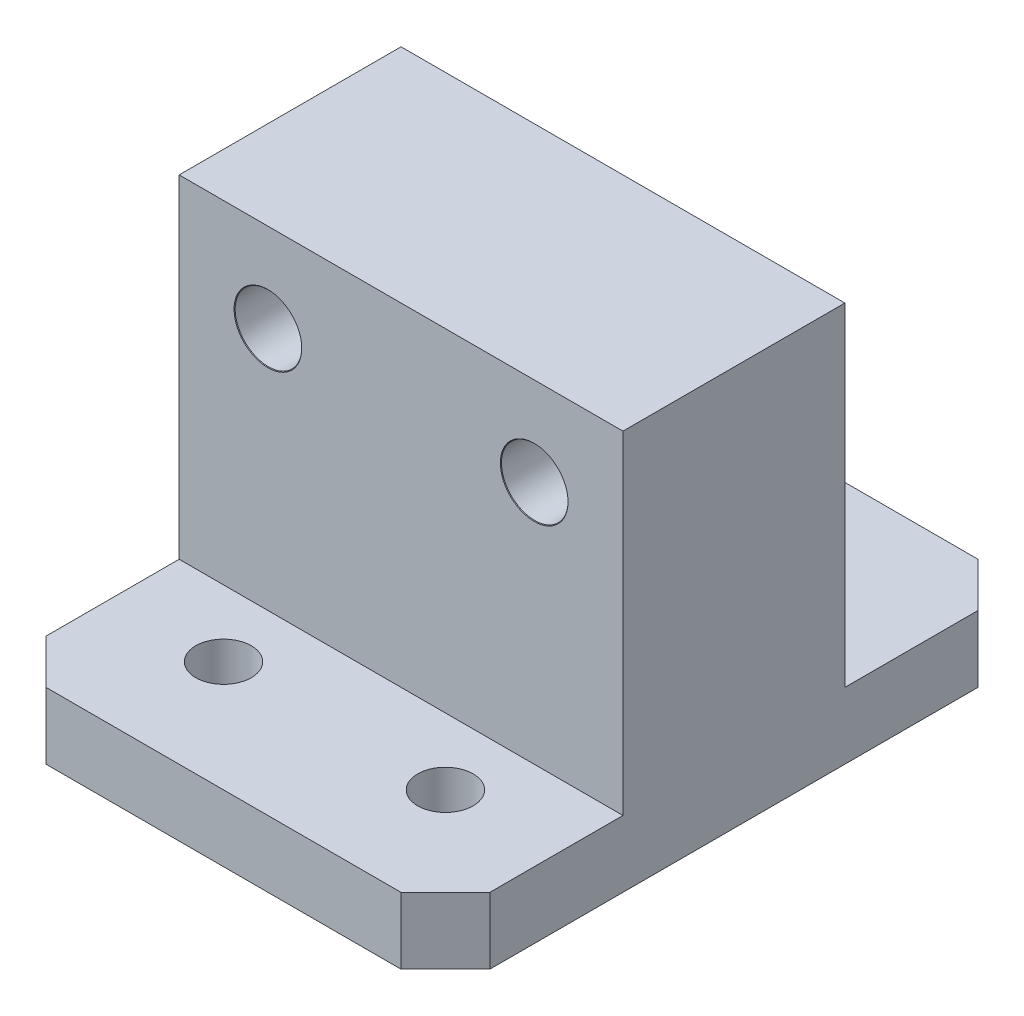
ISO-10303-21;
HEADER;
FILE_DESCRIPTION(('STEP AP214'),'2;1');
FILE_NAME('part.step','',(''),(''),'','','');
FILE_SCHEMA(('AUTOMOTIVE_DESIGN { 1 0 10303 214 1 1 1 1 }'));
ENDSEC;
DATA;
#1=APPLICATION_CONTEXT('core data for automotive mechanical design processes');
#2=APPLICATION_PROTOCOL_DEFINITION('international standard','automotive_design',2000,#1);
#3=PRODUCT_CONTEXT('',#1,'mechanical');
#4=PRODUCT('Part','Part','',(#3));
#5=PRODUCT_RELATED_PRODUCT_CATEGORY('part','',(#4));
#6=PRODUCT_DEFINITION_FORMATION('','',#4);
#7=PRODUCT_DEFINITION_CONTEXT('part definition',#1,'design');
#8=PRODUCT_DEFINITION('design','',#6,#7);
#9=PRODUCT_DEFINITION_SHAPE('','',#8);
#10=(LENGTH_UNIT() NAMED_UNIT(*) SI_UNIT(.MILLI.,.METRE.));
#11=(NAMED_UNIT(*) PLANE_ANGLE_UNIT() SI_UNIT($,.RADIAN.));
#12=(NAMED_UNIT(*) SI_UNIT($,.STERADIAN.) SOLID_ANGLE_UNIT());
#13=UNCERTAINTY_MEASURE_WITH_UNIT(LENGTH_MEASURE(1.E-05),#10,'distance_accuracy_value','');
#14=(GEOMETRIC_REPRESENTATION_CONTEXT(3) GLOBAL_UNCERTAINTY_ASSIGNED_CONTEXT((#13)) GLOBAL_UNIT_ASSIGNED_CONTEXT((#10,
#11,#12)) REPRESENTATION_CONTEXT('',''));
#15=CARTESIAN_POINT('',(0.,0.,0.));
#16=DIRECTION('',(0.,0.,1.));
#17=DIRECTION('',(1.,0.,0.));
#18=AXIS2_PLACEMENT_3D('',#15,#16,#17);
#19=CARTESIAN_POINT('',(0.,-3.,0.));
#20=DIRECTION('',(0.,1.,0.));
#21=DIRECTION('',(0.,0.,1.));
#22=AXIS2_PLACEMENT_3D('',#19,#20,#21);
#23=PLANE('',#22);
#24=CARTESIAN_POINT('',(15.,-3.,13.));
#25=DIRECTION('',(0.,-1.,0.));
#26=DIRECTION('',(0.,0.,-1.));
#27=AXIS2_PLACEMENT_3D('',#24,#25,#26);
#28=CIRCLE('',#27,1.275);
#29=CARTESIAN_POINT('',(15.,-3.,11.725));
#30=VERTEX_POINT('',#29);
#31=EDGE_CURVE('E370',#30,#30,#28,.T.);
#32=ORIENTED_EDGE('',*,*,#31,.F.);
#33=EDGE_LOOP('',(#32));
#34=FACE_BOUND('',#33,.T.);
#35=CARTESIAN_POINT('',(15.,-3.,-3.));
#36=DIRECTION('',(0.,-1.,0.));
#37=DIRECTION('',(0.,0.,-1.));
#38=AXIS2_PLACEMENT_3D('',#35,#36,#37);
#39=CIRCLE('',#38,1.275);
#40=CARTESIAN_POINT('',(15.,-3.,-4.275));
#41=VERTEX_POINT('',#40);
#42=EDGE_CURVE('E352',#41,#41,#39,.T.);
#43=ORIENTED_EDGE('',*,*,#42,.F.);
#44=EDGE_LOOP('',(#43));
#45=FACE_BOUND('',#44,.T.);
#46=DIRECTION('',(1.,0.,0.));
#47=VECTOR('',#46,1.);
#48=CARTESIAN_POINT('',(20.,-3.,-8.));
#49=LINE('',#48,#47);
#50=CARTESIAN_POINT('',(2.,-3.,-8.));
#51=VERTEX_POINT('',#50);
#52=CARTESIAN_POINT('',(18.,-3.,-8.));
#53=VERTEX_POINT('',#52);
#54=EDGE_CURVE('E206',#51,#53,#49,.T.);
#55=ORIENTED_EDGE('',*,*,#54,.T.);
#56=DIRECTION('',(-0.70710678118655,0.,-0.707106781186545));
#57=VECTOR('',#56,1.);
#58=CARTESIAN_POINT('',(20.,-3.,-6.));
#59=LINE('',#58,#57);
#60=CARTESIAN_POINT('',(20.,-3.,-6.));
#61=VERTEX_POINT('',#60);
#62=EDGE_CURVE('E183',#53,#61,#59,.F.);
#63=ORIENTED_EDGE('',*,*,#62,.T.);
#64=DIRECTION('',(0.,0.,1.));
#65=VECTOR('',#64,1.);
#66=CARTESIAN_POINT('',(20.,-3.,18.));
#67=LINE('',#66,#65);
#68=CARTESIAN_POINT('',(20.,-3.,16.));
#69=VERTEX_POINT('',#68);
#70=EDGE_CURVE('E216',#61,#69,#67,.T.);
#71=ORIENTED_EDGE('',*,*,#70,.T.);
#72=DIRECTION('',(0.707106781186546,0.,-0.707106781186549));
#73=VECTOR('',#72,1.);
#74=CARTESIAN_POINT('',(18.,-3.,18.));
#75=LINE('',#74,#73);
#76=CARTESIAN_POINT('',(18.,-3.,18.));
#77=VERTEX_POINT('',#76);
#78=EDGE_CURVE('E181',#69,#77,#75,.F.);
#79=ORIENTED_EDGE('',*,*,#78,.T.);
#80=DIRECTION('',(-1.,0.,0.));
#81=VECTOR('',#80,1.);
#82=CARTESIAN_POINT('',(20.,-3.,18.));
#83=LINE('',#82,#81);
#84=CARTESIAN_POINT('',(2.00000000000001,-3.,18.));
#85=VERTEX_POINT('',#84);
#86=EDGE_CURVE('E207',#77,#85,#83,.T.);
#87=ORIENTED_EDGE('',*,*,#86,.T.);
#88=DIRECTION('',(0.707106781186549,0.,0.707106781186546));
#89=VECTOR('',#88,1.);
#90=CARTESIAN_POINT('',(0.,-3.,16.));
#91=LINE('',#90,#89);
#92=CARTESIAN_POINT('',(0.,-3.,16.));
#93=VERTEX_POINT('',#92);
#94=EDGE_CURVE('E179',#85,#93,#91,.F.);
#95=ORIENTED_EDGE('',*,*,#94,.T.);
#96=DIRECTION('',(0.,0.,-1.));
#97=VECTOR('',#96,1.);
#98=CARTESIAN_POINT('',(0.,-3.,18.));
#99=LINE('',#98,#97);
#100=CARTESIAN_POINT('',(0.,-3.,-5.99999999999999));
#101=VERTEX_POINT('',#100);
#102=EDGE_CURVE('E197',#93,#101,#99,.T.);
#103=ORIENTED_EDGE('',*,*,#102,.T.);
#104=DIRECTION('',(-0.707106781186546,0.,0.707106781186549));
#105=VECTOR('',#104,1.);
#106=CARTESIAN_POINT('',(2.,-3.,-8.));
#107=LINE('',#106,#105);
#108=EDGE_CURVE('E177',#101,#51,#107,.F.);
#109=ORIENTED_EDGE('',*,*,#108,.T.);
#110=EDGE_LOOP('',(#55,#63,#71,#79,#87,#95,#103,#109));
#111=FACE_BOUND('',#110,.T.);
#112=CARTESIAN_POINT('',(5.,-3.,-3.));
#113=DIRECTION('',(0.,-1.,0.));
#114=DIRECTION('',(0.,0.,-1.));
#115=AXIS2_PLACEMENT_3D('',#112,#113,#114);
#116=CIRCLE('',#115,1.275);
#117=CARTESIAN_POINT('',(5.,-3.,-4.275));
#118=VERTEX_POINT('',#117);
#119=EDGE_CURVE('E361',#118,#118,#116,.T.);
#120=ORIENTED_EDGE('',*,*,#119,.F.);
#121=EDGE_LOOP('',(#120));
#122=FACE_BOUND('',#121,.T.);
#123=CARTESIAN_POINT('',(5.,-3.,13.));
#124=DIRECTION('',(0.,-1.,0.));
#125=DIRECTION('',(0.,0.,-1.));
#126=AXIS2_PLACEMENT_3D('',#123,#124,#125);
#127=CIRCLE('',#126,1.275);
#128=CARTESIAN_POINT('',(5.,-3.,11.725));
#129=VERTEX_POINT('',#128);
#130=EDGE_CURVE('E379',#129,#129,#127,.T.);
#131=ORIENTED_EDGE('',*,*,#130,.F.);
#132=EDGE_LOOP('',(#131));
#133=FACE_BOUND('',#132,.T.);
#134=ADVANCED_FACE('F37',(#34,#45,#111,#122,#133),#23,.F.);
#135=CARTESIAN_POINT('',(0.,0.,10.));
#136=DIRECTION('',(1.,0.,0.));
#137=DIRECTION('',(0.,0.,-1.));
#138=AXIS2_PLACEMENT_3D('',#135,#136,#137);
#139=PLANE('',#138);
#140=ORIENTED_EDGE('',*,*,#102,.F.);
#141=DIRECTION('',(0.,1.,0.));
#142=VECTOR('',#141,1.);
#143=CARTESIAN_POINT('',(0.,0.,16.));
#144=LINE('',#143,#142);
#145=CARTESIAN_POINT('',(0.,0.,16.));
#146=VERTEX_POINT('',#145);
#147=EDGE_CURVE('E11',#93,#146,#144,.T.);
#148=ORIENTED_EDGE('',*,*,#147,.T.);
#149=DIRECTION('',(0.,0.,-1.));
#150=VECTOR('',#149,1.);
#151=CARTESIAN_POINT('',(0.,0.,18.));
#152=LINE('',#151,#150);
#153=CARTESIAN_POINT('',(0.,0.,10.));
#154=VERTEX_POINT('',#153);
#155=EDGE_CURVE('E217',#146,#154,#152,.T.);
#156=ORIENTED_EDGE('',*,*,#155,.T.);
#157=DIRECTION('',(0.,-1.,0.));
#158=VECTOR('',#157,1.);
#159=CARTESIAN_POINT('',(0.,0.,10.));
#160=LINE('',#159,#158);
#161=CARTESIAN_POINT('',(0.,15.,10.));
#162=VERTEX_POINT('',#161);
#163=EDGE_CURVE('E155',#162,#154,#160,.T.);
#164=ORIENTED_EDGE('',*,*,#163,.F.);
#165=DIRECTION('',(0.,0.,-1.));
#166=VECTOR('',#165,1.);
#167=CARTESIAN_POINT('',(0.,15.,10.));
#168=LINE('',#167,#166);
#169=CARTESIAN_POINT('',(0.,15.,0.));
#170=VERTEX_POINT('',#169);
#171=EDGE_CURVE('E159',#162,#170,#168,.T.);
#172=ORIENTED_EDGE('',*,*,#171,.T.);
#173=DIRECTION('',(0.,-1.,0.));
#174=VECTOR('',#173,1.);
#175=CARTESIAN_POINT('',(0.,0.,0.));
#176=LINE('',#175,#174);
#177=CARTESIAN_POINT('',(0.,0.,0.));
#178=VERTEX_POINT('',#177);
#179=EDGE_CURVE('E149',#170,#178,#176,.T.);
#180=ORIENTED_EDGE('',*,*,#179,.T.);
#181=CARTESIAN_POINT('',(0.,0.,-5.99999999999999));
#182=VERTEX_POINT('',#181);
#183=EDGE_CURVE('E145',#178,#182,#152,.T.);
#184=ORIENTED_EDGE('',*,*,#183,.T.);
#185=DIRECTION('',(0.,-1.,0.));
#186=VECTOR('',#185,1.);
#187=CARTESIAN_POINT('',(0.,0.,-5.99999999999999));
#188=LINE('',#187,#186);
#189=EDGE_CURVE('E46',#182,#101,#188,.T.);
#190=ORIENTED_EDGE('',*,*,#189,.T.);
#191=EDGE_LOOP('',(#140,#148,#156,#164,#172,#180,#184,#190));
#192=FACE_BOUND('',#191,.T.);
#193=ADVANCED_FACE('F196',(#192),#139,.F.);
#194=CARTESIAN_POINT('',(20.,0.,10.));
#195=DIRECTION('',(-1.,0.,0.));
#196=DIRECTION('',(0.,0.,1.));
#197=AXIS2_PLACEMENT_3D('',#194,#195,#196);
#198=PLANE('',#197);
#199=ORIENTED_EDGE('',*,*,#70,.F.);
#200=DIRECTION('',(0.,1.,0.));
#201=VECTOR('',#200,1.);
#202=CARTESIAN_POINT('',(20.,0.,-6.));
#203=LINE('',#202,#201);
#204=CARTESIAN_POINT('',(20.,0.,-6.));
#205=VERTEX_POINT('',#204);
#206=EDGE_CURVE('E136',#61,#205,#203,.T.);
#207=ORIENTED_EDGE('',*,*,#206,.T.);
#208=DIRECTION('',(0.,0.,1.));
#209=VECTOR('',#208,1.);
#210=CARTESIAN_POINT('',(20.,0.,18.));
#211=LINE('',#210,#209);
#212=CARTESIAN_POINT('',(20.,0.,0.));
#213=VERTEX_POINT('',#212);
#214=EDGE_CURVE('E127',#205,#213,#211,.T.);
#215=ORIENTED_EDGE('',*,*,#214,.T.);
#216=DIRECTION('',(0.,1.,0.));
#217=VECTOR('',#216,1.);
#218=CARTESIAN_POINT('',(20.,0.,0.));
#219=LINE('',#218,#217);
#220=CARTESIAN_POINT('',(20.,15.,0.));
#221=VERTEX_POINT('',#220);
#222=EDGE_CURVE('E133',#213,#221,#219,.T.);
#223=ORIENTED_EDGE('',*,*,#222,.T.);
#224=DIRECTION('',(0.,0.,-1.));
#225=VECTOR('',#224,1.);
#226=CARTESIAN_POINT('',(20.,15.,10.));
#227=LINE('',#226,#225);
#228=CARTESIAN_POINT('',(20.,15.,10.));
#229=VERTEX_POINT('',#228);
#230=EDGE_CURVE('E162',#229,#221,#227,.T.);
#231=ORIENTED_EDGE('',*,*,#230,.F.);
#232=DIRECTION('',(0.,1.,0.));
#233=VECTOR('',#232,1.);
#234=CARTESIAN_POINT('',(20.,0.,10.));
#235=LINE('',#234,#233);
#236=CARTESIAN_POINT('',(20.,0.,10.));
#237=VERTEX_POINT('',#236);
#238=EDGE_CURVE('E247',#237,#229,#235,.T.);
#239=ORIENTED_EDGE('',*,*,#238,.F.);
#240=CARTESIAN_POINT('',(20.,0.,16.));
#241=VERTEX_POINT('',#240);
#242=EDGE_CURVE('E139',#237,#241,#211,.T.);
#243=ORIENTED_EDGE('',*,*,#242,.T.);
#244=DIRECTION('',(0.,-1.,0.));
#245=VECTOR('',#244,1.);
#246=CARTESIAN_POINT('',(20.,0.,16.));
#247=LINE('',#246,#245);
#248=EDGE_CURVE('E165',#241,#69,#247,.T.);
#249=ORIENTED_EDGE('',*,*,#248,.T.);
#250=EDGE_LOOP('',(#199,#207,#215,#223,#231,#239,#243,#249));
#251=FACE_BOUND('',#250,.T.);
#252=ADVANCED_FACE('F130',(#251),#198,.F.);
#253=CARTESIAN_POINT('',(0.,15.,10.));
#254=DIRECTION('',(0.,-1.,0.));
#255=DIRECTION('',(0.,0.,-1.));
#256=AXIS2_PLACEMENT_3D('',#253,#254,#255);
#257=PLANE('',#256);
#258=DIRECTION('',(-1.,0.,0.));
#259=VECTOR('',#258,1.);
#260=CARTESIAN_POINT('',(0.,15.,0.));
#261=LINE('',#260,#259);
#262=EDGE_CURVE('E153',#221,#170,#261,.T.);
#263=ORIENTED_EDGE('',*,*,#262,.T.);
#264=ORIENTED_EDGE('',*,*,#171,.F.);
#265=DIRECTION('',(-1.,0.,0.));
#266=VECTOR('',#265,1.);
#267=CARTESIAN_POINT('',(0.,15.,10.));
#268=LINE('',#267,#266);
#269=EDGE_CURVE('E163',#229,#162,#268,.T.);
#270=ORIENTED_EDGE('',*,*,#269,.F.);
#271=ORIENTED_EDGE('',*,*,#230,.T.);
#272=EDGE_LOOP('',(#263,#264,#270,#271));
#273=FACE_BOUND('',#272,.T.);
#274=ADVANCED_FACE('F253',(#273),#257,.F.);
#275=CARTESIAN_POINT('',(0.,0.,10.));
#276=DIRECTION('',(0.,0.,-1.));
#277=DIRECTION('',(-1.,0.,0.));
#278=AXIS2_PLACEMENT_3D('',#275,#276,#277);
#279=PLANE('',#278);
#280=CARTESIAN_POINT('',(4.,11.,10.));
#281=DIRECTION('',(0.,0.,1.));
#282=DIRECTION('',(1.,0.,0.));
#283=AXIS2_PLACEMENT_3D('',#280,#281,#282);
#284=CIRCLE('',#283,1.525);
#285=CARTESIAN_POINT('',(5.525,11.,10.));
#286=VERTEX_POINT('',#285);
#287=EDGE_CURVE('E224',#286,#286,#284,.T.);
#288=ORIENTED_EDGE('',*,*,#287,.F.);
#289=EDGE_LOOP('',(#288));
#290=FACE_BOUND('',#289,.T.);
#291=CARTESIAN_POINT('',(16.,11.,10.));
#292=DIRECTION('',(0.,0.,1.));
#293=DIRECTION('',(1.,0.,0.));
#294=AXIS2_PLACEMENT_3D('',#291,#292,#293);
#295=CIRCLE('',#294,1.525);
#296=CARTESIAN_POINT('',(17.525,11.,10.));
#297=VERTEX_POINT('',#296);
#298=EDGE_CURVE('E233',#297,#297,#295,.T.);
#299=ORIENTED_EDGE('',*,*,#298,.F.);
#300=EDGE_LOOP('',(#299));
#301=FACE_BOUND('',#300,.T.);
#302=ORIENTED_EDGE('',*,*,#163,.T.);
#303=DIRECTION('',(1.,0.,0.));
#304=VECTOR('',#303,1.);
#305=CARTESIAN_POINT('',(0.,0.,10.));
#306=LINE('',#305,#304);
#307=EDGE_CURVE('E244',#154,#237,#306,.T.);
#308=ORIENTED_EDGE('',*,*,#307,.T.);
#309=ORIENTED_EDGE('',*,*,#238,.T.);
#310=ORIENTED_EDGE('',*,*,#269,.T.);
#311=EDGE_LOOP('',(#302,#308,#309,#310));
#312=FACE_BOUND('',#311,.T.);
#313=ADVANCED_FACE('F258',(#290,#301,#312),#279,.F.);
#314=CARTESIAN_POINT('',(0.,0.,0.));
#315=DIRECTION('',(0.,0.,-1.));
#316=DIRECTION('',(-1.,0.,0.));
#317=AXIS2_PLACEMENT_3D('',#314,#315,#316);
#318=PLANE('',#317);
#319=CARTESIAN_POINT('',(4.,11.,0.));
#320=DIRECTION('',(0.,0.,1.));
#321=DIRECTION('',(1.,0.,0.));
#322=AXIS2_PLACEMENT_3D('',#319,#320,#321);
#323=CIRCLE('',#322,1.5);
#324=CARTESIAN_POINT('',(5.5,11.,0.));
#325=VERTEX_POINT('',#324);
#326=EDGE_CURVE('E230',#325,#325,#323,.T.);
#327=ORIENTED_EDGE('',*,*,#326,.T.);
#328=EDGE_LOOP('',(#327));
#329=FACE_BOUND('',#328,.T.);
#330=CARTESIAN_POINT('',(16.,11.,0.));
#331=DIRECTION('',(0.,0.,1.));
#332=DIRECTION('',(1.,0.,0.));
#333=AXIS2_PLACEMENT_3D('',#330,#331,#332);
#334=CIRCLE('',#333,1.5);
#335=CARTESIAN_POINT('',(17.5,11.,0.));
#336=VERTEX_POINT('',#335);
#337=EDGE_CURVE('E239',#336,#336,#334,.T.);
#338=ORIENTED_EDGE('',*,*,#337,.T.);
#339=EDGE_LOOP('',(#338));
#340=FACE_BOUND('',#339,.T.);
#341=ORIENTED_EDGE('',*,*,#179,.F.);
#342=ORIENTED_EDGE('',*,*,#262,.F.);
#343=ORIENTED_EDGE('',*,*,#222,.F.);
#344=DIRECTION('',(1.,0.,0.));
#345=VECTOR('',#344,1.);
#346=CARTESIAN_POINT('',(0.,0.,0.));
#347=LINE('',#346,#345);
#348=EDGE_CURVE('E142',#178,#213,#347,.T.);
#349=ORIENTED_EDGE('',*,*,#348,.F.);
#350=EDGE_LOOP('',(#341,#342,#343,#349));
#351=FACE_BOUND('',#350,.T.);
#352=ADVANCED_FACE('F152',(#329,#340,#351),#318,.T.);
#353=CARTESIAN_POINT('',(16.,11.,10.));
#354=DIRECTION('',(0.,0.,1.));
#355=DIRECTION('',(1.,0.,0.));
#356=AXIS2_PLACEMENT_3D('',#353,#354,#355);
#357=CYLINDRICAL_SURFACE('',#356,1.49999999999999);
#358=ORIENTED_EDGE('',*,*,#337,.F.);
#359=EDGE_LOOP('',(#358));
#360=FACE_BOUND('',#359,.T.);
#361=CARTESIAN_POINT('',(16.,11.,9.975));
#362=DIRECTION('',(0.,0.,1.));
#363=DIRECTION('',(1.,0.,0.));
#364=AXIS2_PLACEMENT_3D('',#361,#362,#363);
#365=CIRCLE('',#364,1.49999999999999);
#366=CARTESIAN_POINT('',(17.5,11.,9.975));
#367=VERTEX_POINT('',#366);
#368=EDGE_CURVE('E236',#367,#367,#365,.T.);
#369=ORIENTED_EDGE('',*,*,#368,.T.);
#370=EDGE_LOOP('',(#369));
#371=FACE_BOUND('',#370,.T.);
#372=ADVANCED_FACE('F312',(#360,#371),#357,.F.);
#373=CARTESIAN_POINT('',(16.,11.,10.));
#374=DIRECTION('',(0.,0.,1.));
#375=DIRECTION('',(1.,0.,0.));
#376=AXIS2_PLACEMENT_3D('',#373,#374,#375);
#377=CONICAL_SURFACE('',#376,1.525,0.785398163397691);
#378=ORIENTED_EDGE('',*,*,#368,.F.);
#379=EDGE_LOOP('',(#378));
#380=FACE_BOUND('',#379,.T.);
#381=ORIENTED_EDGE('',*,*,#298,.T.);
#382=EDGE_LOOP('',(#381));
#383=FACE_BOUND('',#382,.T.);
#384=ADVANCED_FACE('F308',(#380,#383),#377,.F.);
#385=CARTESIAN_POINT('',(4.,11.,10.));
#386=DIRECTION('',(0.,0.,1.));
#387=DIRECTION('',(1.,0.,0.));
#388=AXIS2_PLACEMENT_3D('',#385,#386,#387);
#389=CYLINDRICAL_SURFACE('',#388,1.49999999999999);
#390=ORIENTED_EDGE('',*,*,#326,.F.);
#391=EDGE_LOOP('',(#390));
#392=FACE_BOUND('',#391,.T.);
#393=CARTESIAN_POINT('',(4.,11.,9.975));
#394=DIRECTION('',(0.,0.,1.));
#395=DIRECTION('',(1.,0.,0.));
#396=AXIS2_PLACEMENT_3D('',#393,#394,#395);
#397=CIRCLE('',#396,1.49999999999999);
#398=CARTESIAN_POINT('',(5.49999999999999,11.,9.975));
#399=VERTEX_POINT('',#398);
#400=EDGE_CURVE('E227',#399,#399,#397,.T.);
#401=ORIENTED_EDGE('',*,*,#400,.T.);
#402=EDGE_LOOP('',(#401));
#403=FACE_BOUND('',#402,.T.);
#404=ADVANCED_FACE('F304',(#392,#403),#389,.F.);
#405=CARTESIAN_POINT('',(4.,11.,10.));
#406=DIRECTION('',(0.,0.,1.));
#407=DIRECTION('',(1.,0.,0.));
#408=AXIS2_PLACEMENT_3D('',#405,#406,#407);
#409=CONICAL_SURFACE('',#408,1.525,0.785398163397726);
#410=ORIENTED_EDGE('',*,*,#400,.F.);
#411=EDGE_LOOP('',(#410));
#412=FACE_BOUND('',#411,.T.);
#413=ORIENTED_EDGE('',*,*,#287,.T.);
#414=EDGE_LOOP('',(#413));
#415=FACE_BOUND('',#414,.T.);
#416=ADVANCED_FACE('F301',(#412,#415),#409,.F.);
#417=CARTESIAN_POINT('',(0.,0.,0.));
#418=DIRECTION('',(0.,1.,0.));
#419=DIRECTION('',(0.,0.,1.));
#420=AXIS2_PLACEMENT_3D('',#417,#418,#419);
#421=PLANE('',#420);
#422=CARTESIAN_POINT('',(5.,0.,13.));
#423=DIRECTION('',(0.,1.,0.));
#424=DIRECTION('',(0.,0.,1.));
#425=AXIS2_PLACEMENT_3D('',#422,#423,#424);
#426=CIRCLE('',#425,1.25);
#427=CARTESIAN_POINT('',(5.,0.,14.25));
#428=VERTEX_POINT('',#427);
#429=EDGE_CURVE('E373',#428,#428,#426,.T.);
#430=ORIENTED_EDGE('',*,*,#429,.F.);
#431=EDGE_LOOP('',(#430));
#432=FACE_BOUND('',#431,.T.);
#433=CARTESIAN_POINT('',(15.,0.,13.));
#434=DIRECTION('',(0.,1.,0.));
#435=DIRECTION('',(0.,0.,1.));
#436=AXIS2_PLACEMENT_3D('',#433,#434,#435);
#437=CIRCLE('',#436,1.25);
#438=CARTESIAN_POINT('',(15.,0.,14.25));
#439=VERTEX_POINT('',#438);
#440=EDGE_CURVE('E364',#439,#439,#437,.T.);
#441=ORIENTED_EDGE('',*,*,#440,.F.);
#442=EDGE_LOOP('',(#441));
#443=FACE_BOUND('',#442,.T.);
#444=DIRECTION('',(-1.,0.,0.));
#445=VECTOR('',#444,1.);
#446=CARTESIAN_POINT('',(20.,0.,18.));
#447=LINE('',#446,#445);
#448=CARTESIAN_POINT('',(18.,0.,18.));
#449=VERTEX_POINT('',#448);
#450=CARTESIAN_POINT('',(2.00000000000001,0.,18.));
#451=VERTEX_POINT('',#450);
#452=EDGE_CURVE('E138',#449,#451,#447,.T.);
#453=ORIENTED_EDGE('',*,*,#452,.F.);
#454=DIRECTION('',(-0.707106781186546,0.,0.707106781186549));
#455=VECTOR('',#454,1.);
#456=CARTESIAN_POINT('',(18.,0.,18.));
#457=LINE('',#456,#455);
#458=EDGE_CURVE('E191',#449,#241,#457,.F.);
#459=ORIENTED_EDGE('',*,*,#458,.T.);
#460=ORIENTED_EDGE('',*,*,#242,.F.);
#461=ORIENTED_EDGE('',*,*,#307,.F.);
#462=ORIENTED_EDGE('',*,*,#155,.F.);
#463=DIRECTION('',(-0.707106781186549,0.,-0.707106781186546));
#464=VECTOR('',#463,1.);
#465=CARTESIAN_POINT('',(-8.,0.,8.00000000000004));
#466=LINE('',#465,#464);
#467=EDGE_CURVE('E53',#146,#451,#466,.F.);
#468=ORIENTED_EDGE('',*,*,#467,.T.);
#469=EDGE_LOOP('',(#453,#459,#460,#461,#462,#468));
#470=FACE_BOUND('',#469,.T.);
#471=ADVANCED_FACE('F260',(#432,#443,#470),#421,.T.);
#472=CARTESIAN_POINT('',(20.,-3.,18.));
#473=DIRECTION('',(0.,0.,-1.));
#474=DIRECTION('',(-1.,0.,0.));
#475=AXIS2_PLACEMENT_3D('',#472,#473,#474);
#476=PLANE('',#475);
#477=ORIENTED_EDGE('',*,*,#86,.F.);
#478=DIRECTION('',(0.,1.,0.));
#479=VECTOR('',#478,1.);
#480=CARTESIAN_POINT('',(18.,-3.,18.));
#481=LINE('',#480,#479);
#482=EDGE_CURVE('E187',#77,#449,#481,.T.);
#483=ORIENTED_EDGE('',*,*,#482,.T.);
#484=ORIENTED_EDGE('',*,*,#452,.T.);
#485=DIRECTION('',(0.,-1.,0.));
#486=VECTOR('',#485,1.);
#487=CARTESIAN_POINT('',(2.00000000000001,-3.,18.));
#488=LINE('',#487,#486);
#489=EDGE_CURVE('E185',#451,#85,#488,.T.);
#490=ORIENTED_EDGE('',*,*,#489,.T.);
#491=EDGE_LOOP('',(#477,#483,#484,#490));
#492=FACE_BOUND('',#491,.T.);
#493=ADVANCED_FACE('F268',(#492),#476,.F.);
#494=CARTESIAN_POINT('',(20.,-3.,-8.));
#495=DIRECTION('',(0.,0.,1.));
#496=DIRECTION('',(1.,0.,0.));
#497=AXIS2_PLACEMENT_3D('',#494,#495,#496);
#498=PLANE('',#497);
#499=DIRECTION('',(1.,0.,0.));
#500=VECTOR('',#499,1.);
#501=CARTESIAN_POINT('',(20.,0.,-8.));
#502=LINE('',#501,#500);
#503=CARTESIAN_POINT('',(2.,0.,-8.));
#504=VERTEX_POINT('',#503);
#505=CARTESIAN_POINT('',(18.,0.,-8.));
#506=VERTEX_POINT('',#505);
#507=EDGE_CURVE('E214',#504,#506,#502,.T.);
#508=ORIENTED_EDGE('',*,*,#507,.T.);
#509=DIRECTION('',(0.,-1.,0.));
#510=VECTOR('',#509,1.);
#511=CARTESIAN_POINT('',(18.,-3.,-8.));
#512=LINE('',#511,#510);
#513=EDGE_CURVE('E175',#506,#53,#512,.T.);
#514=ORIENTED_EDGE('',*,*,#513,.T.);
#515=ORIENTED_EDGE('',*,*,#54,.F.);
#516=DIRECTION('',(0.,1.,0.));
#517=VECTOR('',#516,1.);
#518=CARTESIAN_POINT('',(2.,-3.,-8.));
#519=LINE('',#518,#517);
#520=EDGE_CURVE('E172',#51,#504,#519,.T.);
#521=ORIENTED_EDGE('',*,*,#520,.T.);
#522=EDGE_LOOP('',(#508,#514,#515,#521));
#523=FACE_BOUND('',#522,.T.);
#524=ADVANCED_FACE('F213',(#523),#498,.F.);
#525=CARTESIAN_POINT('',(5.,0.,-3.));
#526=DIRECTION('',(0.,1.,0.));
#527=DIRECTION('',(0.,0.,1.));
#528=AXIS2_PLACEMENT_3D('',#525,#526,#527);
#529=CIRCLE('',#528,1.25);
#530=CARTESIAN_POINT('',(5.,0.,-1.75));
#531=VERTEX_POINT('',#530);
#532=EDGE_CURVE('E355',#531,#531,#529,.T.);
#533=ORIENTED_EDGE('',*,*,#532,.F.);
#534=EDGE_LOOP('',(#533));
#535=FACE_BOUND('',#534,.T.);
#536=CARTESIAN_POINT('',(15.,0.,-3.));
#537=DIRECTION('',(0.,1.,0.));
#538=DIRECTION('',(0.,0.,1.));
#539=AXIS2_PLACEMENT_3D('',#536,#537,#538);
#540=CIRCLE('',#539,1.25);
#541=CARTESIAN_POINT('',(15.,0.,-1.75));
#542=VERTEX_POINT('',#541);
#543=EDGE_CURVE('E261',#542,#542,#540,.T.);
#544=ORIENTED_EDGE('',*,*,#543,.F.);
#545=EDGE_LOOP('',(#544));
#546=FACE_BOUND('',#545,.T.);
#547=ORIENTED_EDGE('',*,*,#214,.F.);
#548=DIRECTION('',(0.70710678118655,0.,0.707106781186545));
#549=VECTOR('',#548,1.);
#550=CARTESIAN_POINT('',(12.9999999999999,0.,-13.));
#551=LINE('',#550,#549);
#552=EDGE_CURVE('E170',#205,#506,#551,.F.);
#553=ORIENTED_EDGE('',*,*,#552,.T.);
#554=ORIENTED_EDGE('',*,*,#507,.F.);
#555=DIRECTION('',(0.707106781186546,0.,-0.707106781186549));
#556=VECTOR('',#555,1.);
#557=CARTESIAN_POINT('',(-3.,0.,-2.99999999999998));
#558=LINE('',#557,#556);
#559=EDGE_CURVE('E168',#504,#182,#558,.F.);
#560=ORIENTED_EDGE('',*,*,#559,.T.);
#561=ORIENTED_EDGE('',*,*,#183,.F.);
#562=ORIENTED_EDGE('',*,*,#348,.T.);
#563=EDGE_LOOP('',(#547,#553,#554,#560,#561,#562));
#564=FACE_BOUND('',#563,.T.);
#565=ADVANCED_FACE('F143',(#535,#546,#564),#421,.T.);
#566=CARTESIAN_POINT('',(15.,-3.,-3.));
#567=DIRECTION('',(0.,-1.,0.));
#568=DIRECTION('',(0.,0.,-1.));
#569=AXIS2_PLACEMENT_3D('',#566,#567,#568);
#570=CYLINDRICAL_SURFACE('',#569,1.25);
#571=CARTESIAN_POINT('',(15.,-2.975,-3.));
#572=DIRECTION('',(0.,-1.,0.));
#573=DIRECTION('',(0.,0.,-1.));
#574=AXIS2_PLACEMENT_3D('',#571,#572,#573);
#575=CIRCLE('',#574,1.25);
#576=CARTESIAN_POINT('',(15.,-2.975,-4.24999999999999));
#577=VERTEX_POINT('',#576);
#578=EDGE_CURVE('E263',#577,#577,#575,.T.);
#579=ORIENTED_EDGE('',*,*,#578,.T.);
#580=EDGE_LOOP('',(#579));
#581=FACE_BOUND('',#580,.T.);
#582=ORIENTED_EDGE('',*,*,#543,.T.);
#583=EDGE_LOOP('',(#582));
#584=FACE_BOUND('',#583,.T.);
#585=ADVANCED_FACE('F292',(#581,#584),#570,.F.);
#586=CARTESIAN_POINT('',(15.,-3.,-3.));
#587=DIRECTION('',(0.,-1.,0.));
#588=DIRECTION('',(0.,0.,-1.));
#589=AXIS2_PLACEMENT_3D('',#586,#587,#588);
#590=CONICAL_SURFACE('',#589,1.275,0.785398163397483);
#591=ORIENTED_EDGE('',*,*,#578,.F.);
#592=EDGE_LOOP('',(#591));
#593=FACE_BOUND('',#592,.T.);
#594=ORIENTED_EDGE('',*,*,#42,.T.);
#595=EDGE_LOOP('',(#594));
#596=FACE_BOUND('',#595,.T.);
#597=ADVANCED_FACE('F412',(#593,#596),#590,.F.);
#598=CARTESIAN_POINT('',(5.,-3.,-3.));
#599=DIRECTION('',(0.,-1.,0.));
#600=DIRECTION('',(0.,0.,-1.));
#601=AXIS2_PLACEMENT_3D('',#598,#599,#600);
#602=CYLINDRICAL_SURFACE('',#601,1.25);
#603=CARTESIAN_POINT('',(5.,-2.975,-3.));
#604=DIRECTION('',(0.,-1.,0.));
#605=DIRECTION('',(0.,0.,-1.));
#606=AXIS2_PLACEMENT_3D('',#603,#604,#605);
#607=CIRCLE('',#606,1.25);
#608=CARTESIAN_POINT('',(5.,-2.975,-4.25));
#609=VERTEX_POINT('',#608);
#610=EDGE_CURVE('E358',#609,#609,#607,.T.);
#611=ORIENTED_EDGE('',*,*,#610,.T.);
#612=EDGE_LOOP('',(#611));
#613=FACE_BOUND('',#612,.T.);
#614=ORIENTED_EDGE('',*,*,#532,.T.);
#615=EDGE_LOOP('',(#614));
#616=FACE_BOUND('',#615,.T.);
#617=ADVANCED_FACE('F407',(#613,#616),#602,.F.);
#618=CARTESIAN_POINT('',(5.,-3.,-3.));
#619=DIRECTION('',(0.,-1.,0.));
#620=DIRECTION('',(0.,0.,-1.));
#621=AXIS2_PLACEMENT_3D('',#618,#619,#620);
#622=CONICAL_SURFACE('',#621,1.275,0.785398163397448);
#623=ORIENTED_EDGE('',*,*,#610,.F.);
#624=EDGE_LOOP('',(#623));
#625=FACE_BOUND('',#624,.T.);
#626=ORIENTED_EDGE('',*,*,#119,.T.);
#627=EDGE_LOOP('',(#626));
#628=FACE_BOUND('',#627,.T.);
#629=ADVANCED_FACE('F398',(#625,#628),#622,.F.);
#630=CARTESIAN_POINT('',(15.,-3.,13.));
#631=DIRECTION('',(0.,-1.,0.));
#632=DIRECTION('',(0.,0.,-1.));
#633=AXIS2_PLACEMENT_3D('',#630,#631,#632);
#634=CYLINDRICAL_SURFACE('',#633,1.25);
#635=CARTESIAN_POINT('',(15.,-2.975,13.));
#636=DIRECTION('',(0.,-1.,0.));
#637=DIRECTION('',(0.,0.,-1.));
#638=AXIS2_PLACEMENT_3D('',#635,#636,#637);
#639=CIRCLE('',#638,1.25);
#640=CARTESIAN_POINT('',(15.,-2.975,11.75));
#641=VERTEX_POINT('',#640);
#642=EDGE_CURVE('E367',#641,#641,#639,.T.);
#643=ORIENTED_EDGE('',*,*,#642,.T.);
#644=EDGE_LOOP('',(#643));
#645=FACE_BOUND('',#644,.T.);
#646=ORIENTED_EDGE('',*,*,#440,.T.);
#647=EDGE_LOOP('',(#646));
#648=FACE_BOUND('',#647,.T.);
#649=ADVANCED_FACE('F396',(#645,#648),#634,.F.);
#650=CARTESIAN_POINT('',(15.,-3.,13.));
#651=DIRECTION('',(0.,-1.,0.));
#652=DIRECTION('',(0.,0.,-1.));
#653=AXIS2_PLACEMENT_3D('',#650,#651,#652);
#654=CONICAL_SURFACE('',#653,1.275,0.785398163397414);
#655=ORIENTED_EDGE('',*,*,#642,.F.);
#656=EDGE_LOOP('',(#655));
#657=FACE_BOUND('',#656,.T.);
#658=ORIENTED_EDGE('',*,*,#31,.T.);
#659=EDGE_LOOP('',(#658));
#660=FACE_BOUND('',#659,.T.);
#661=ADVANCED_FACE('F388',(#657,#660),#654,.F.);
#662=CARTESIAN_POINT('',(5.,-3.,13.));
#663=DIRECTION('',(0.,-1.,0.));
#664=DIRECTION('',(0.,0.,-1.));
#665=AXIS2_PLACEMENT_3D('',#662,#663,#664);
#666=CYLINDRICAL_SURFACE('',#665,1.25);
#667=CARTESIAN_POINT('',(5.,-2.975,13.));
#668=DIRECTION('',(0.,-1.,0.));
#669=DIRECTION('',(0.,0.,-1.));
#670=AXIS2_PLACEMENT_3D('',#667,#668,#669);
#671=CIRCLE('',#670,1.25);
#672=CARTESIAN_POINT('',(5.,-2.975,11.75));
#673=VERTEX_POINT('',#672);
#674=EDGE_CURVE('E376',#673,#673,#671,.T.);
#675=ORIENTED_EDGE('',*,*,#674,.T.);
#676=EDGE_LOOP('',(#675));
#677=FACE_BOUND('',#676,.T.);
#678=ORIENTED_EDGE('',*,*,#429,.T.);
#679=EDGE_LOOP('',(#678));
#680=FACE_BOUND('',#679,.T.);
#681=ADVANCED_FACE('F343',(#677,#680),#666,.F.);
#682=CARTESIAN_POINT('',(5.,-3.,13.));
#683=DIRECTION('',(0.,-1.,0.));
#684=DIRECTION('',(0.,0.,-1.));
#685=AXIS2_PLACEMENT_3D('',#682,#683,#684);
#686=CONICAL_SURFACE('',#685,1.275,0.785398163397466);
#687=ORIENTED_EDGE('',*,*,#674,.F.);
#688=EDGE_LOOP('',(#687));
#689=FACE_BOUND('',#688,.T.);
#690=ORIENTED_EDGE('',*,*,#130,.T.);
#691=EDGE_LOOP('',(#690));
#692=FACE_BOUND('',#691,.T.);
#693=ADVANCED_FACE('F332',(#689,#692),#686,.F.);
#694=CARTESIAN_POINT('',(20.,0.,-6.));
#695=DIRECTION('',(-0.707106781186545,0.,0.70710678118655));
#696=DIRECTION('',(0.,1.,0.));
#697=AXIS2_PLACEMENT_3D('',#694,#695,#696);
#698=PLANE('',#697);
#699=ORIENTED_EDGE('',*,*,#62,.F.);
#700=ORIENTED_EDGE('',*,*,#513,.F.);
#701=ORIENTED_EDGE('',*,*,#552,.F.);
#702=ORIENTED_EDGE('',*,*,#206,.F.);
#703=EDGE_LOOP('',(#699,#700,#701,#702));
#704=FACE_BOUND('',#703,.T.);
#705=ADVANCED_FACE('F277',(#704),#698,.F.);
#706=CARTESIAN_POINT('',(18.,-3.,18.));
#707=DIRECTION('',(-0.707106781186549,0.,-0.707106781186546));
#708=DIRECTION('',(0.,1.,0.));
#709=AXIS2_PLACEMENT_3D('',#706,#707,#708);
#710=PLANE('',#709);
#711=ORIENTED_EDGE('',*,*,#78,.F.);
#712=ORIENTED_EDGE('',*,*,#248,.F.);
#713=ORIENTED_EDGE('',*,*,#458,.F.);
#714=ORIENTED_EDGE('',*,*,#482,.F.);
#715=EDGE_LOOP('',(#711,#712,#713,#714));
#716=FACE_BOUND('',#715,.T.);
#717=ADVANCED_FACE('F272',(#716),#710,.F.);
#718=CARTESIAN_POINT('',(0.,0.,16.));
#719=DIRECTION('',(0.707106781186546,0.,-0.707106781186549));
#720=DIRECTION('',(0.,1.,0.));
#721=AXIS2_PLACEMENT_3D('',#718,#719,#720);
#722=PLANE('',#721);
#723=ORIENTED_EDGE('',*,*,#94,.F.);
#724=ORIENTED_EDGE('',*,*,#489,.F.);
#725=ORIENTED_EDGE('',*,*,#467,.F.);
#726=ORIENTED_EDGE('',*,*,#147,.F.);
#727=EDGE_LOOP('',(#723,#724,#725,#726));
#728=FACE_BOUND('',#727,.T.);
#729=ADVANCED_FACE('F270',(#728),#722,.F.);
#730=CARTESIAN_POINT('',(2.,-3.,-8.));
#731=DIRECTION('',(0.707106781186549,0.,0.707106781186546));
#732=DIRECTION('',(0.,1.,0.));
#733=AXIS2_PLACEMENT_3D('',#730,#731,#732);
#734=PLANE('',#733);
#735=ORIENTED_EDGE('',*,*,#108,.F.);
#736=ORIENTED_EDGE('',*,*,#189,.F.);
#737=ORIENTED_EDGE('',*,*,#559,.F.);
#738=ORIENTED_EDGE('',*,*,#520,.F.);
#739=EDGE_LOOP('',(#735,#736,#737,#738));
#740=FACE_BOUND('',#739,.T.);
#741=ADVANCED_FACE('F40',(#740),#734,.F.);
#742=CLOSED_SHELL('',(#134,#193,#252,#274,#313,#352,#372,#384,#404,#416,#471,#493,#524,#565,
#585,#597,#617,#629,#649,#661,#681,#693,#705,#717,#729,#741));
#743=MANIFOLD_SOLID_BREP('B2',#742);
#744=ADVANCED_BREP_SHAPE_REPRESENTATION('',(#18,#743),#14);
#745=SHAPE_DEFINITION_REPRESENTATION(#9,#744);
ENDSEC;
END-ISO-10303-21;
